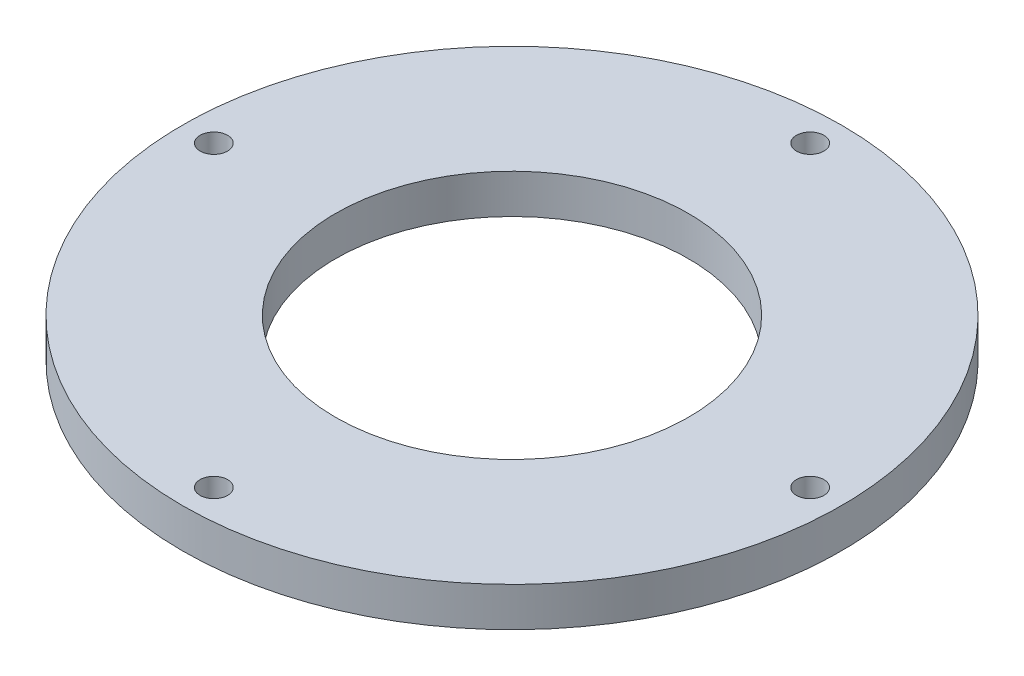
ISO-10303-21;
HEADER;
FILE_DESCRIPTION(('STEP AP214'),'2;1');
FILE_NAME('part.step','',(''),(''),'','','');
FILE_SCHEMA(('AUTOMOTIVE_DESIGN { 1 0 10303 214 1 1 1 1 }'));
ENDSEC;
DATA;
#1=APPLICATION_CONTEXT('core data for automotive mechanical design processes');
#2=APPLICATION_PROTOCOL_DEFINITION('international standard','automotive_design',2000,#1);
#3=PRODUCT_CONTEXT('',#1,'mechanical');
#4=PRODUCT('Part','Part','',(#3));
#5=PRODUCT_RELATED_PRODUCT_CATEGORY('part','',(#4));
#6=PRODUCT_DEFINITION_FORMATION('','',#4);
#7=PRODUCT_DEFINITION_CONTEXT('part definition',#1,'design');
#8=PRODUCT_DEFINITION('design','',#6,#7);
#9=PRODUCT_DEFINITION_SHAPE('','',#8);
#10=(LENGTH_UNIT() NAMED_UNIT(*) SI_UNIT(.MILLI.,.METRE.));
#11=(NAMED_UNIT(*) PLANE_ANGLE_UNIT() SI_UNIT($,.RADIAN.));
#12=(NAMED_UNIT(*) SI_UNIT($,.STERADIAN.) SOLID_ANGLE_UNIT());
#13=UNCERTAINTY_MEASURE_WITH_UNIT(LENGTH_MEASURE(1.E-05),#10,'distance_accuracy_value','');
#14=(GEOMETRIC_REPRESENTATION_CONTEXT(3) GLOBAL_UNCERTAINTY_ASSIGNED_CONTEXT((#13)) GLOBAL_UNIT_ASSIGNED_CONTEXT((#10,
#11,#12)) REPRESENTATION_CONTEXT('',''));
#15=CARTESIAN_POINT('',(0.,0.,0.));
#16=DIRECTION('',(0.,0.,1.));
#17=DIRECTION('',(1.,0.,0.));
#18=AXIS2_PLACEMENT_3D('',#15,#16,#17);
#19=CARTESIAN_POINT('',(0.,10.,0.));
#20=DIRECTION('',(0.,1.,0.));
#21=DIRECTION('',(0.,0.,1.));
#22=AXIS2_PLACEMENT_3D('',#19,#20,#21);
#23=PLANE('',#22);
#24=CARTESIAN_POINT('',(-76.,10.,0.));
#25=DIRECTION('',(0.,1.,0.));
#26=DIRECTION('',(0.,0.,1.));
#27=AXIS2_PLACEMENT_3D('',#24,#25,#26);
#28=CIRCLE('',#27,3.49999999999999);
#29=CARTESIAN_POINT('',(-76.,10.,3.49999999999999));
#30=VERTEX_POINT('',#29);
#31=EDGE_CURVE('E70',#30,#30,#28,.T.);
#32=ORIENTED_EDGE('',*,*,#31,.F.);
#33=EDGE_LOOP('',(#32));
#34=FACE_BOUND('',#33,.T.);
#35=CARTESIAN_POINT('',(0.,10.,-76.));
#36=DIRECTION('',(0.,1.,0.));
#37=DIRECTION('',(0.,0.,1.));
#38=AXIS2_PLACEMENT_3D('',#35,#36,#37);
#39=CIRCLE('',#38,3.49999999999999);
#40=CARTESIAN_POINT('',(0.,10.,-72.5));
#41=VERTEX_POINT('',#40);
#42=EDGE_CURVE('E64',#41,#41,#39,.T.);
#43=ORIENTED_EDGE('',*,*,#42,.F.);
#44=EDGE_LOOP('',(#43));
#45=FACE_BOUND('',#44,.T.);
#46=CARTESIAN_POINT('',(76.,10.,0.));
#47=DIRECTION('',(0.,1.,0.));
#48=DIRECTION('',(0.,0.,1.));
#49=AXIS2_PLACEMENT_3D('',#46,#47,#48);
#50=CIRCLE('',#49,3.49999999999999);
#51=CARTESIAN_POINT('',(76.,10.,3.49999999999999));
#52=VERTEX_POINT('',#51);
#53=EDGE_CURVE('E58',#52,#52,#50,.T.);
#54=ORIENTED_EDGE('',*,*,#53,.F.);
#55=EDGE_LOOP('',(#54));
#56=FACE_BOUND('',#55,.T.);
#57=CARTESIAN_POINT('',(0.,10.,76.));
#58=DIRECTION('',(0.,1.,0.));
#59=DIRECTION('',(0.,0.,1.));
#60=AXIS2_PLACEMENT_3D('',#57,#58,#59);
#61=CIRCLE('',#60,3.49999999999999);
#62=CARTESIAN_POINT('',(0.,10.,79.5));
#63=VERTEX_POINT('',#62);
#64=EDGE_CURVE('E52',#63,#63,#61,.T.);
#65=ORIENTED_EDGE('',*,*,#64,.F.);
#66=EDGE_LOOP('',(#65));
#67=FACE_BOUND('',#66,.T.);
#68=CARTESIAN_POINT('',(0.,10.,0.));
#69=DIRECTION('',(0.,1.,0.));
#70=DIRECTION('',(0.,0.,1.));
#71=AXIS2_PLACEMENT_3D('',#68,#69,#70);
#72=CIRCLE('',#71,84.);
#73=CARTESIAN_POINT('',(0.,10.,84.));
#74=VERTEX_POINT('',#73);
#75=EDGE_CURVE('E10',#74,#74,#72,.T.);
#76=ORIENTED_EDGE('',*,*,#75,.T.);
#77=EDGE_LOOP('',(#76));
#78=FACE_BOUND('',#77,.T.);
#79=CARTESIAN_POINT('',(0.,10.,0.));
#80=DIRECTION('',(0.,1.,0.));
#81=DIRECTION('',(0.,0.,1.));
#82=AXIS2_PLACEMENT_3D('',#79,#80,#81);
#83=CIRCLE('',#82,45.);
#84=CARTESIAN_POINT('',(0.,10.,45.));
#85=VERTEX_POINT('',#84);
#86=EDGE_CURVE('E42',#85,#85,#83,.T.);
#87=ORIENTED_EDGE('',*,*,#86,.F.);
#88=EDGE_LOOP('',(#87));
#89=FACE_BOUND('',#88,.T.);
#90=ADVANCED_FACE('F31',(#34,#45,#56,#67,#78,#89),#23,.T.);
#91=CARTESIAN_POINT('',(0.,0.,0.));
#92=DIRECTION('',(0.,1.,0.));
#93=DIRECTION('',(0.,0.,1.));
#94=AXIS2_PLACEMENT_3D('',#91,#92,#93);
#95=PLANE('',#94);
#96=CARTESIAN_POINT('',(-76.,0.,0.));
#97=DIRECTION('',(0.,1.,0.));
#98=DIRECTION('',(0.,0.,1.));
#99=AXIS2_PLACEMENT_3D('',#96,#97,#98);
#100=CIRCLE('',#99,3.49999999999999);
#101=CARTESIAN_POINT('',(-76.,0.,3.49999999999999));
#102=VERTEX_POINT('',#101);
#103=EDGE_CURVE('E67',#102,#102,#100,.T.);
#104=ORIENTED_EDGE('',*,*,#103,.T.);
#105=EDGE_LOOP('',(#104));
#106=FACE_BOUND('',#105,.T.);
#107=CARTESIAN_POINT('',(0.,0.,-76.));
#108=DIRECTION('',(0.,1.,0.));
#109=DIRECTION('',(0.,0.,1.));
#110=AXIS2_PLACEMENT_3D('',#107,#108,#109);
#111=CIRCLE('',#110,3.49999999999999);
#112=CARTESIAN_POINT('',(0.,0.,-72.5));
#113=VERTEX_POINT('',#112);
#114=EDGE_CURVE('E61',#113,#113,#111,.T.);
#115=ORIENTED_EDGE('',*,*,#114,.T.);
#116=EDGE_LOOP('',(#115));
#117=FACE_BOUND('',#116,.T.);
#118=CARTESIAN_POINT('',(76.,0.,0.));
#119=DIRECTION('',(0.,1.,0.));
#120=DIRECTION('',(0.,0.,1.));
#121=AXIS2_PLACEMENT_3D('',#118,#119,#120);
#122=CIRCLE('',#121,3.49999999999999);
#123=CARTESIAN_POINT('',(76.,0.,3.49999999999999));
#124=VERTEX_POINT('',#123);
#125=EDGE_CURVE('E55',#124,#124,#122,.T.);
#126=ORIENTED_EDGE('',*,*,#125,.T.);
#127=EDGE_LOOP('',(#126));
#128=FACE_BOUND('',#127,.T.);
#129=CARTESIAN_POINT('',(0.,0.,76.));
#130=DIRECTION('',(0.,1.,0.));
#131=DIRECTION('',(0.,0.,1.));
#132=AXIS2_PLACEMENT_3D('',#129,#130,#131);
#133=CIRCLE('',#132,3.49999999999999);
#134=CARTESIAN_POINT('',(0.,0.,79.5));
#135=VERTEX_POINT('',#134);
#136=EDGE_CURVE('E47',#135,#135,#133,.T.);
#137=ORIENTED_EDGE('',*,*,#136,.T.);
#138=EDGE_LOOP('',(#137));
#139=FACE_BOUND('',#138,.T.);
#140=CARTESIAN_POINT('',(0.,0.,0.));
#141=DIRECTION('',(0.,1.,0.));
#142=DIRECTION('',(0.,0.,1.));
#143=AXIS2_PLACEMENT_3D('',#140,#141,#142);
#144=CIRCLE('',#143,84.);
#145=CARTESIAN_POINT('',(0.,0.,84.));
#146=VERTEX_POINT('',#145);
#147=EDGE_CURVE('E35',#146,#146,#144,.T.);
#148=ORIENTED_EDGE('',*,*,#147,.F.);
#149=EDGE_LOOP('',(#148));
#150=FACE_BOUND('',#149,.T.);
#151=CARTESIAN_POINT('',(0.,0.,0.));
#152=DIRECTION('',(0.,1.,0.));
#153=DIRECTION('',(0.,0.,1.));
#154=AXIS2_PLACEMENT_3D('',#151,#152,#153);
#155=CIRCLE('',#154,45.);
#156=CARTESIAN_POINT('',(0.,0.,45.));
#157=VERTEX_POINT('',#156);
#158=EDGE_CURVE('E44',#157,#157,#155,.T.);
#159=ORIENTED_EDGE('',*,*,#158,.T.);
#160=EDGE_LOOP('',(#159));
#161=FACE_BOUND('',#160,.T.);
#162=ADVANCED_FACE('F78',(#106,#117,#128,#139,#150,#161),#95,.F.);
#163=CARTESIAN_POINT('',(0.,10.,0.));
#164=DIRECTION('',(0.,-1.,0.));
#165=DIRECTION('',(0.,0.,-1.));
#166=AXIS2_PLACEMENT_3D('',#163,#164,#165);
#167=CYLINDRICAL_SURFACE('',#166,84.);
#168=ORIENTED_EDGE('',*,*,#75,.F.);
#169=EDGE_LOOP('',(#168));
#170=FACE_BOUND('',#169,.T.);
#171=ORIENTED_EDGE('',*,*,#147,.T.);
#172=EDGE_LOOP('',(#171));
#173=FACE_BOUND('',#172,.T.);
#174=ADVANCED_FACE('F33',(#170,#173),#167,.T.);
#175=CARTESIAN_POINT('',(0.,10.,0.));
#176=DIRECTION('',(0.,-1.,0.));
#177=DIRECTION('',(0.,0.,-1.));
#178=AXIS2_PLACEMENT_3D('',#175,#176,#177);
#179=CYLINDRICAL_SURFACE('',#178,45.);
#180=ORIENTED_EDGE('',*,*,#86,.T.);
#181=EDGE_LOOP('',(#180));
#182=FACE_BOUND('',#181,.T.);
#183=ORIENTED_EDGE('',*,*,#158,.F.);
#184=EDGE_LOOP('',(#183));
#185=FACE_BOUND('',#184,.T.);
#186=ADVANCED_FACE('F88',(#182,#185),#179,.F.);
#187=CARTESIAN_POINT('',(0.,10.,76.));
#188=DIRECTION('',(0.,1.,0.));
#189=DIRECTION('',(0.,0.,1.));
#190=AXIS2_PLACEMENT_3D('',#187,#188,#189);
#191=CYLINDRICAL_SURFACE('',#190,3.49999999999999);
#192=ORIENTED_EDGE('',*,*,#136,.F.);
#193=EDGE_LOOP('',(#192));
#194=FACE_BOUND('',#193,.T.);
#195=ORIENTED_EDGE('',*,*,#64,.T.);
#196=EDGE_LOOP('',(#195));
#197=FACE_BOUND('',#196,.T.);
#198=ADVANCED_FACE('F91',(#194,#197),#191,.F.);
#199=CARTESIAN_POINT('',(76.,10.,0.));
#200=DIRECTION('',(0.,1.,0.));
#201=DIRECTION('',(0.,0.,1.));
#202=AXIS2_PLACEMENT_3D('',#199,#200,#201);
#203=CYLINDRICAL_SURFACE('',#202,3.49999999999999);
#204=ORIENTED_EDGE('',*,*,#125,.F.);
#205=EDGE_LOOP('',(#204));
#206=FACE_BOUND('',#205,.T.);
#207=ORIENTED_EDGE('',*,*,#53,.T.);
#208=EDGE_LOOP('',(#207));
#209=FACE_BOUND('',#208,.T.);
#210=ADVANCED_FACE('F105',(#206,#209),#203,.F.);
#211=CARTESIAN_POINT('',(0.,10.,-76.));
#212=DIRECTION('',(0.,1.,0.));
#213=DIRECTION('',(0.,0.,1.));
#214=AXIS2_PLACEMENT_3D('',#211,#212,#213);
#215=CYLINDRICAL_SURFACE('',#214,3.49999999999999);
#216=ORIENTED_EDGE('',*,*,#114,.F.);
#217=EDGE_LOOP('',(#216));
#218=FACE_BOUND('',#217,.T.);
#219=ORIENTED_EDGE('',*,*,#42,.T.);
#220=EDGE_LOOP('',(#219));
#221=FACE_BOUND('',#220,.T.);
#222=ADVANCED_FACE('F109',(#218,#221),#215,.F.);
#223=CARTESIAN_POINT('',(-76.,10.,0.));
#224=DIRECTION('',(0.,1.,0.));
#225=DIRECTION('',(0.,0.,1.));
#226=AXIS2_PLACEMENT_3D('',#223,#224,#225);
#227=CYLINDRICAL_SURFACE('',#226,3.49999999999999);
#228=ORIENTED_EDGE('',*,*,#103,.F.);
#229=EDGE_LOOP('',(#228));
#230=FACE_BOUND('',#229,.T.);
#231=ORIENTED_EDGE('',*,*,#31,.T.);
#232=EDGE_LOOP('',(#231));
#233=FACE_BOUND('',#232,.T.);
#234=ADVANCED_FACE('F74',(#230,#233),#227,.F.);
#235=CLOSED_SHELL('',(#90,#162,#174,#186,#198,#210,#222,#234));
#236=MANIFOLD_SOLID_BREP('B2',#235);
#237=ADVANCED_BREP_SHAPE_REPRESENTATION('',(#18,#236),#14);
#238=SHAPE_DEFINITION_REPRESENTATION(#9,#237);
ENDSEC;
END-ISO-10303-21;
